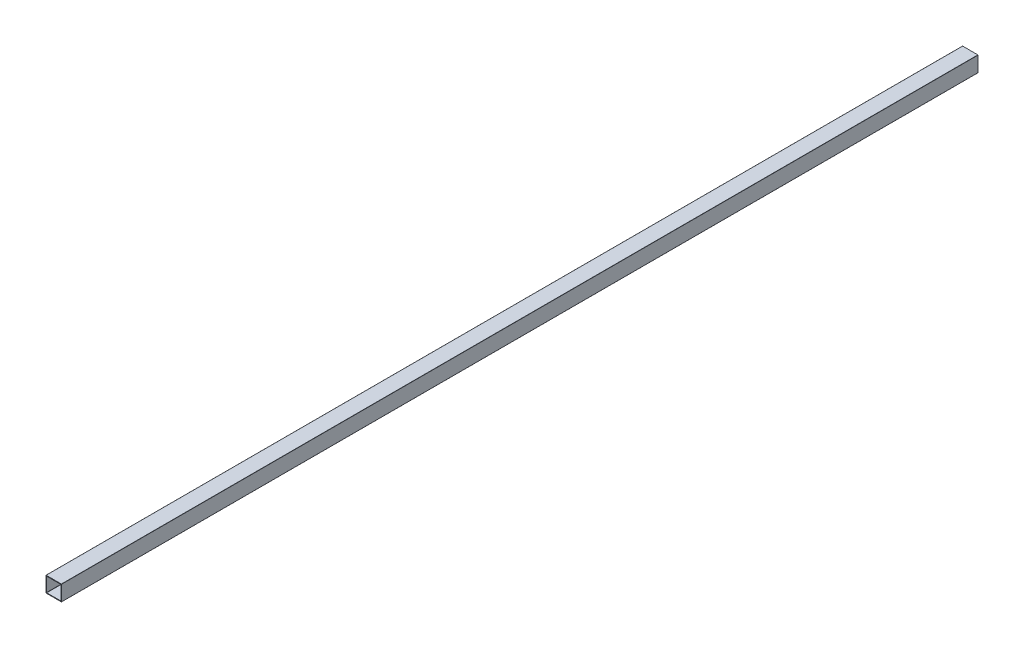
ISO-10303-21;
HEADER;
FILE_DESCRIPTION(('STEP AP214'),'2;1');
FILE_NAME('part.step','',(''),(''),'','','');
FILE_SCHEMA(('AUTOMOTIVE_DESIGN { 1 0 10303 214 1 1 1 1 }'));
ENDSEC;
DATA;
#1=APPLICATION_CONTEXT('core data for automotive mechanical design processes');
#2=APPLICATION_PROTOCOL_DEFINITION('international standard','automotive_design',2000,#1);
#3=PRODUCT_CONTEXT('',#1,'mechanical');
#4=PRODUCT('Part','Part','',(#3));
#5=PRODUCT_RELATED_PRODUCT_CATEGORY('part','',(#4));
#6=PRODUCT_DEFINITION_FORMATION('','',#4);
#7=PRODUCT_DEFINITION_CONTEXT('part definition',#1,'design');
#8=PRODUCT_DEFINITION('design','',#6,#7);
#9=PRODUCT_DEFINITION_SHAPE('','',#8);
#10=(LENGTH_UNIT() NAMED_UNIT(*) SI_UNIT(.MILLI.,.METRE.));
#11=(NAMED_UNIT(*) PLANE_ANGLE_UNIT() SI_UNIT($,.RADIAN.));
#12=(NAMED_UNIT(*) SI_UNIT($,.STERADIAN.) SOLID_ANGLE_UNIT());
#13=UNCERTAINTY_MEASURE_WITH_UNIT(LENGTH_MEASURE(1.E-05),#10,'distance_accuracy_value','');
#14=(GEOMETRIC_REPRESENTATION_CONTEXT(3) GLOBAL_UNCERTAINTY_ASSIGNED_CONTEXT((#13)) GLOBAL_UNIT_ASSIGNED_CONTEXT((#10,
#11,#12)) REPRESENTATION_CONTEXT('',''));
#15=CARTESIAN_POINT('',(0.,0.,0.));
#16=DIRECTION('',(0.,0.,1.));
#17=DIRECTION('',(1.,0.,0.));
#18=AXIS2_PLACEMENT_3D('',#15,#16,#17);
#19=CARTESIAN_POINT('',(50.8,-50.8,-6000.));
#20=DIRECTION('',(1.,0.,0.));
#21=DIRECTION('',(0.,0.,-1.));
#22=AXIS2_PLACEMENT_3D('',#19,#20,#21);
#23=PLANE('',#22);
#24=DIRECTION('',(0.,1.,0.));
#25=VECTOR('',#24,1.);
#26=CARTESIAN_POINT('',(50.8,-50.8,0.));
#27=LINE('',#26,#25);
#28=CARTESIAN_POINT('',(50.8,-49.8,0.));
#29=VERTEX_POINT('',#28);
#30=CARTESIAN_POINT('',(50.8,49.8,0.));
#31=VERTEX_POINT('',#30);
#32=EDGE_CURVE('E197',#29,#31,#27,.T.);
#33=ORIENTED_EDGE('',*,*,#32,.F.);
#34=DIRECTION('',(0.,0.,1.));
#35=VECTOR('',#34,1.);
#36=CARTESIAN_POINT('',(50.8,-49.8,-6000.));
#37=LINE('',#36,#35);
#38=CARTESIAN_POINT('',(50.8,-49.8,-6000.));
#39=VERTEX_POINT('',#38);
#40=EDGE_CURVE('E158',#29,#39,#37,.F.);
#41=ORIENTED_EDGE('',*,*,#40,.T.);
#42=DIRECTION('',(0.,1.,0.));
#43=VECTOR('',#42,1.);
#44=CARTESIAN_POINT('',(50.8,-50.8,-6000.));
#45=LINE('',#44,#43);
#46=CARTESIAN_POINT('',(50.8,49.8,-6000.));
#47=VERTEX_POINT('',#46);
#48=EDGE_CURVE('E185',#39,#47,#45,.T.);
#49=ORIENTED_EDGE('',*,*,#48,.T.);
#50=DIRECTION('',(0.,0.,1.));
#51=VECTOR('',#50,1.);
#52=CARTESIAN_POINT('',(50.8,49.8,-6000.));
#53=LINE('',#52,#51);
#54=EDGE_CURVE('E251',#47,#31,#53,.T.);
#55=ORIENTED_EDGE('',*,*,#54,.T.);
#56=EDGE_LOOP('',(#33,#41,#49,#55));
#57=FACE_BOUND('',#56,.T.);
#58=ADVANCED_FACE('F33',(#57),#23,.T.);
#59=CARTESIAN_POINT('',(-50.8,-50.8,-6000.));
#60=DIRECTION('',(0.,-1.,0.));
#61=DIRECTION('',(0.,0.,-1.));
#62=AXIS2_PLACEMENT_3D('',#59,#60,#61);
#63=PLANE('',#62);
#64=DIRECTION('',(1.,0.,0.));
#65=VECTOR('',#64,1.);
#66=CARTESIAN_POINT('',(-50.8,-50.8,0.));
#67=LINE('',#66,#65);
#68=CARTESIAN_POINT('',(-49.8,-50.8,0.));
#69=VERTEX_POINT('',#68);
#70=CARTESIAN_POINT('',(49.8,-50.8,0.));
#71=VERTEX_POINT('',#70);
#72=EDGE_CURVE('E189',#69,#71,#67,.T.);
#73=ORIENTED_EDGE('',*,*,#72,.F.);
#74=DIRECTION('',(0.,0.,1.));
#75=VECTOR('',#74,1.);
#76=CARTESIAN_POINT('',(-49.8,-50.8,-6000.));
#77=LINE('',#76,#75);
#78=CARTESIAN_POINT('',(-49.8,-50.8,-6000.));
#79=VERTEX_POINT('',#78);
#80=EDGE_CURVE('E238',#69,#79,#77,.F.);
#81=ORIENTED_EDGE('',*,*,#80,.T.);
#82=DIRECTION('',(1.,0.,0.));
#83=VECTOR('',#82,1.);
#84=CARTESIAN_POINT('',(-50.8,-50.8,-6000.));
#85=LINE('',#84,#83);
#86=CARTESIAN_POINT('',(49.8,-50.8,-6000.));
#87=VERTEX_POINT('',#86);
#88=EDGE_CURVE('E194',#79,#87,#85,.T.);
#89=ORIENTED_EDGE('',*,*,#88,.T.);
#90=DIRECTION('',(0.,0.,1.));
#91=VECTOR('',#90,1.);
#92=CARTESIAN_POINT('',(49.8,-50.8,-6000.));
#93=LINE('',#92,#91);
#94=EDGE_CURVE('E235',#87,#71,#93,.T.);
#95=ORIENTED_EDGE('',*,*,#94,.T.);
#96=EDGE_LOOP('',(#73,#81,#89,#95));
#97=FACE_BOUND('',#96,.T.);
#98=ADVANCED_FACE('F305',(#97),#63,.T.);
#99=CARTESIAN_POINT('',(-50.8,-50.8,-6000.));
#100=DIRECTION('',(-1.,0.,0.));
#101=DIRECTION('',(0.,0.,1.));
#102=AXIS2_PLACEMENT_3D('',#99,#100,#101);
#103=PLANE('',#102);
#104=DIRECTION('',(0.,-1.,0.));
#105=VECTOR('',#104,1.);
#106=CARTESIAN_POINT('',(-50.8,-50.8,-6000.));
#107=LINE('',#106,#105);
#108=CARTESIAN_POINT('',(-50.8,49.8,-6000.));
#109=VERTEX_POINT('',#108);
#110=CARTESIAN_POINT('',(-50.8,-49.8,-6000.));
#111=VERTEX_POINT('',#110);
#112=EDGE_CURVE('E191',#109,#111,#107,.T.);
#113=ORIENTED_EDGE('',*,*,#112,.T.);
#114=DIRECTION('',(0.,0.,1.));
#115=VECTOR('',#114,1.);
#116=CARTESIAN_POINT('',(-50.8,-49.8,-6000.));
#117=LINE('',#116,#115);
#118=CARTESIAN_POINT('',(-50.8,-49.8,0.));
#119=VERTEX_POINT('',#118);
#120=EDGE_CURVE('E224',#111,#119,#117,.T.);
#121=ORIENTED_EDGE('',*,*,#120,.T.);
#122=DIRECTION('',(0.,-1.,0.));
#123=VECTOR('',#122,1.);
#124=CARTESIAN_POINT('',(-50.8,-50.8,0.));
#125=LINE('',#124,#123);
#126=CARTESIAN_POINT('',(-50.8,49.8,0.));
#127=VERTEX_POINT('',#126);
#128=EDGE_CURVE('E203',#127,#119,#125,.T.);
#129=ORIENTED_EDGE('',*,*,#128,.F.);
#130=DIRECTION('',(0.,0.,1.));
#131=VECTOR('',#130,1.);
#132=CARTESIAN_POINT('',(-50.8,49.8,-6000.));
#133=LINE('',#132,#131);
#134=EDGE_CURVE('E222',#127,#109,#133,.F.);
#135=ORIENTED_EDGE('',*,*,#134,.T.);
#136=EDGE_LOOP('',(#113,#121,#129,#135));
#137=FACE_BOUND('',#136,.T.);
#138=ADVANCED_FACE('F311',(#137),#103,.T.);
#139=CARTESIAN_POINT('',(-50.8,50.8,-6000.));
#140=DIRECTION('',(0.,1.,0.));
#141=DIRECTION('',(0.,0.,1.));
#142=AXIS2_PLACEMENT_3D('',#139,#140,#141);
#143=PLANE('',#142);
#144=DIRECTION('',(-1.,0.,0.));
#145=VECTOR('',#144,1.);
#146=CARTESIAN_POINT('',(-50.8,50.8,-6000.));
#147=LINE('',#146,#145);
#148=CARTESIAN_POINT('',(49.8,50.8,-6000.));
#149=VERTEX_POINT('',#148);
#150=CARTESIAN_POINT('',(-49.8,50.8,-6000.));
#151=VERTEX_POINT('',#150);
#152=EDGE_CURVE('E188',#149,#151,#147,.T.);
#153=ORIENTED_EDGE('',*,*,#152,.T.);
#154=DIRECTION('',(0.,0.,1.));
#155=VECTOR('',#154,1.);
#156=CARTESIAN_POINT('',(-49.8,50.8,-6000.));
#157=LINE('',#156,#155);
#158=CARTESIAN_POINT('',(-49.8,50.8,0.));
#159=VERTEX_POINT('',#158);
#160=EDGE_CURVE('E248',#151,#159,#157,.T.);
#161=ORIENTED_EDGE('',*,*,#160,.T.);
#162=DIRECTION('',(-1.,0.,0.));
#163=VECTOR('',#162,1.);
#164=CARTESIAN_POINT('',(-50.8,50.8,0.));
#165=LINE('',#164,#163);
#166=CARTESIAN_POINT('',(49.8,50.8,0.));
#167=VERTEX_POINT('',#166);
#168=EDGE_CURVE('E200',#167,#159,#165,.T.);
#169=ORIENTED_EDGE('',*,*,#168,.F.);
#170=DIRECTION('',(0.,0.,1.));
#171=VECTOR('',#170,1.);
#172=CARTESIAN_POINT('',(49.8,50.8,-6000.));
#173=LINE('',#172,#171);
#174=EDGE_CURVE('E55',#167,#149,#173,.F.);
#175=ORIENTED_EDGE('',*,*,#174,.T.);
#176=EDGE_LOOP('',(#153,#161,#169,#175));
#177=FACE_BOUND('',#176,.T.);
#178=ADVANCED_FACE('F316',(#177),#143,.T.);
#179=CARTESIAN_POINT('',(0.,0.,-6000.));
#180=DIRECTION('',(0.,0.,-1.));
#181=DIRECTION('',(-1.,0.,0.));
#182=AXIS2_PLACEMENT_3D('',#179,#180,#181);
#183=PLANE('',#182);
#184=DIRECTION('',(0.,-1.,0.));
#185=VECTOR('',#184,1.);
#186=CARTESIAN_POINT('',(-47.,-47.,-6000.));
#187=LINE('',#186,#185);
#188=CARTESIAN_POINT('',(-47.,46.,-6000.));
#189=VERTEX_POINT('',#188);
#190=CARTESIAN_POINT('',(-47.,-46.,-6000.));
#191=VERTEX_POINT('',#190);
#192=EDGE_CURVE('E167',#189,#191,#187,.T.);
#193=ORIENTED_EDGE('',*,*,#192,.T.);
#194=CARTESIAN_POINT('',(-46.,-46.,-6000.));
#195=DIRECTION('',(0.,0.,-1.));
#196=DIRECTION('',(-1.,0.,0.));
#197=AXIS2_PLACEMENT_3D('',#194,#195,#196);
#198=CIRCLE('',#197,1.);
#199=CARTESIAN_POINT('',(-46.,-47.,-6000.));
#200=VERTEX_POINT('',#199);
#201=EDGE_CURVE('E11',#191,#200,#198,.F.);
#202=ORIENTED_EDGE('',*,*,#201,.T.);
#203=DIRECTION('',(1.,0.,0.));
#204=VECTOR('',#203,1.);
#205=CARTESIAN_POINT('',(-47.,-47.,-6000.));
#206=LINE('',#205,#204);
#207=CARTESIAN_POINT('',(46.,-47.,-6000.));
#208=VERTEX_POINT('',#207);
#209=EDGE_CURVE('E175',#200,#208,#206,.T.);
#210=ORIENTED_EDGE('',*,*,#209,.T.);
#211=CARTESIAN_POINT('',(46.,-46.,-6000.));
#212=DIRECTION('',(0.,0.,-1.));
#213=DIRECTION('',(-1.,0.,0.));
#214=AXIS2_PLACEMENT_3D('',#211,#212,#213);
#215=CIRCLE('',#214,1.);
#216=CARTESIAN_POINT('',(47.,-46.,-6000.));
#217=VERTEX_POINT('',#216);
#218=EDGE_CURVE('E262',#208,#217,#215,.F.);
#219=ORIENTED_EDGE('',*,*,#218,.T.);
#220=DIRECTION('',(0.,1.,0.));
#221=VECTOR('',#220,1.);
#222=CARTESIAN_POINT('',(47.,-47.,-6000.));
#223=LINE('',#222,#221);
#224=CARTESIAN_POINT('',(47.,46.,-6000.));
#225=VERTEX_POINT('',#224);
#226=EDGE_CURVE('E179',#217,#225,#223,.T.);
#227=ORIENTED_EDGE('',*,*,#226,.T.);
#228=CARTESIAN_POINT('',(46.,46.,-6000.));
#229=DIRECTION('',(0.,0.,-1.));
#230=DIRECTION('',(-1.,0.,0.));
#231=AXIS2_PLACEMENT_3D('',#228,#229,#230);
#232=CIRCLE('',#231,1.);
#233=CARTESIAN_POINT('',(46.,47.,-6000.));
#234=VERTEX_POINT('',#233);
#235=EDGE_CURVE('E258',#225,#234,#232,.F.);
#236=ORIENTED_EDGE('',*,*,#235,.T.);
#237=DIRECTION('',(-1.,0.,0.));
#238=VECTOR('',#237,1.);
#239=CARTESIAN_POINT('',(-47.,47.,-6000.));
#240=LINE('',#239,#238);
#241=CARTESIAN_POINT('',(-46.,47.,-6000.));
#242=VERTEX_POINT('',#241);
#243=EDGE_CURVE('E277',#234,#242,#240,.T.);
#244=ORIENTED_EDGE('',*,*,#243,.T.);
#245=CARTESIAN_POINT('',(-46.,46.,-6000.));
#246=DIRECTION('',(0.,0.,-1.));
#247=DIRECTION('',(-1.,0.,0.));
#248=AXIS2_PLACEMENT_3D('',#245,#246,#247);
#249=CIRCLE('',#248,1.);
#250=EDGE_CURVE('E157',#242,#189,#249,.F.);
#251=ORIENTED_EDGE('',*,*,#250,.T.);
#252=EDGE_LOOP('',(#193,#202,#210,#219,#227,#236,#244,#251));
#253=FACE_BOUND('',#252,.T.);
#254=ORIENTED_EDGE('',*,*,#88,.F.);
#255=CARTESIAN_POINT('',(-49.8,-49.8,-6000.));
#256=DIRECTION('',(0.,0.,-1.));
#257=DIRECTION('',(-1.,0.,0.));
#258=AXIS2_PLACEMENT_3D('',#255,#256,#257);
#259=CIRCLE('',#258,1.);
#260=EDGE_CURVE('E245',#79,#111,#259,.T.);
#261=ORIENTED_EDGE('',*,*,#260,.T.);
#262=ORIENTED_EDGE('',*,*,#112,.F.);
#263=CARTESIAN_POINT('',(-49.8,49.8,-6000.));
#264=DIRECTION('',(0.,0.,-1.));
#265=DIRECTION('',(-1.,0.,0.));
#266=AXIS2_PLACEMENT_3D('',#263,#264,#265);
#267=CIRCLE('',#266,1.);
#268=EDGE_CURVE('E48',#109,#151,#267,.T.);
#269=ORIENTED_EDGE('',*,*,#268,.T.);
#270=ORIENTED_EDGE('',*,*,#152,.F.);
#271=CARTESIAN_POINT('',(49.8,49.8,-6000.));
#272=DIRECTION('',(0.,0.,-1.));
#273=DIRECTION('',(-1.,0.,0.));
#274=AXIS2_PLACEMENT_3D('',#271,#272,#273);
#275=CIRCLE('',#274,1.);
#276=EDGE_CURVE('E240',#149,#47,#275,.T.);
#277=ORIENTED_EDGE('',*,*,#276,.T.);
#278=ORIENTED_EDGE('',*,*,#48,.F.);
#279=CARTESIAN_POINT('',(49.8,-49.8,-6000.));
#280=DIRECTION('',(0.,0.,-1.));
#281=DIRECTION('',(-1.,0.,0.));
#282=AXIS2_PLACEMENT_3D('',#279,#280,#281);
#283=CIRCLE('',#282,1.);
#284=EDGE_CURVE('E242',#39,#87,#283,.T.);
#285=ORIENTED_EDGE('',*,*,#284,.T.);
#286=EDGE_LOOP('',(#254,#261,#262,#269,#270,#277,#278,#285));
#287=FACE_BOUND('',#286,.T.);
#288=ADVANCED_FACE('F267',(#253,#287),#183,.T.);
#289=CARTESIAN_POINT('',(0.,0.,0.));
#290=DIRECTION('',(0.,0.,-1.));
#291=DIRECTION('',(-1.,0.,0.));
#292=AXIS2_PLACEMENT_3D('',#289,#290,#291);
#293=PLANE('',#292);
#294=DIRECTION('',(0.,1.,0.));
#295=VECTOR('',#294,1.);
#296=CARTESIAN_POINT('',(47.,-47.,0.));
#297=LINE('',#296,#295);
#298=CARTESIAN_POINT('',(47.,-46.,0.));
#299=VERTEX_POINT('',#298);
#300=CARTESIAN_POINT('',(47.,46.,0.));
#301=VERTEX_POINT('',#300);
#302=EDGE_CURVE('E181',#299,#301,#297,.T.);
#303=ORIENTED_EDGE('',*,*,#302,.F.);
#304=CARTESIAN_POINT('',(46.,-46.,0.));
#305=DIRECTION('',(0.,0.,-1.));
#306=DIRECTION('',(-1.,0.,0.));
#307=AXIS2_PLACEMENT_3D('',#304,#305,#306);
#308=CIRCLE('',#307,1.);
#309=CARTESIAN_POINT('',(46.,-47.,0.));
#310=VERTEX_POINT('',#309);
#311=EDGE_CURVE('E260',#299,#310,#308,.T.);
#312=ORIENTED_EDGE('',*,*,#311,.T.);
#313=DIRECTION('',(1.,0.,0.));
#314=VECTOR('',#313,1.);
#315=CARTESIAN_POINT('',(-47.,-47.,0.));
#316=LINE('',#315,#314);
#317=CARTESIAN_POINT('',(-46.,-47.,0.));
#318=VERTEX_POINT('',#317);
#319=EDGE_CURVE('E281',#318,#310,#316,.T.);
#320=ORIENTED_EDGE('',*,*,#319,.F.);
#321=CARTESIAN_POINT('',(-46.,-46.,0.));
#322=DIRECTION('',(0.,0.,-1.));
#323=DIRECTION('',(-1.,0.,0.));
#324=AXIS2_PLACEMENT_3D('',#321,#322,#323);
#325=CIRCLE('',#324,1.);
#326=CARTESIAN_POINT('',(-47.,-46.,0.));
#327=VERTEX_POINT('',#326);
#328=EDGE_CURVE('E41',#318,#327,#325,.T.);
#329=ORIENTED_EDGE('',*,*,#328,.T.);
#330=DIRECTION('',(0.,-1.,0.));
#331=VECTOR('',#330,1.);
#332=CARTESIAN_POINT('',(-47.,-47.,0.));
#333=LINE('',#332,#331);
#334=CARTESIAN_POINT('',(-47.,46.,0.));
#335=VERTEX_POINT('',#334);
#336=EDGE_CURVE('E164',#335,#327,#333,.T.);
#337=ORIENTED_EDGE('',*,*,#336,.F.);
#338=CARTESIAN_POINT('',(-46.,46.,0.));
#339=DIRECTION('',(0.,0.,-1.));
#340=DIRECTION('',(-1.,0.,0.));
#341=AXIS2_PLACEMENT_3D('',#338,#339,#340);
#342=CIRCLE('',#341,1.);
#343=CARTESIAN_POINT('',(-46.,47.,0.));
#344=VERTEX_POINT('',#343);
#345=EDGE_CURVE('E147',#335,#344,#342,.T.);
#346=ORIENTED_EDGE('',*,*,#345,.T.);
#347=DIRECTION('',(-1.,0.,0.));
#348=VECTOR('',#347,1.);
#349=CARTESIAN_POINT('',(-47.,47.,0.));
#350=LINE('',#349,#348);
#351=CARTESIAN_POINT('',(46.,47.,0.));
#352=VERTEX_POINT('',#351);
#353=EDGE_CURVE('E176',#352,#344,#350,.T.);
#354=ORIENTED_EDGE('',*,*,#353,.F.);
#355=CARTESIAN_POINT('',(46.,46.,0.));
#356=DIRECTION('',(0.,0.,-1.));
#357=DIRECTION('',(-1.,0.,0.));
#358=AXIS2_PLACEMENT_3D('',#355,#356,#357);
#359=CIRCLE('',#358,1.);
#360=EDGE_CURVE('E256',#352,#301,#359,.T.);
#361=ORIENTED_EDGE('',*,*,#360,.T.);
#362=EDGE_LOOP('',(#303,#312,#320,#329,#337,#346,#354,#361));
#363=FACE_BOUND('',#362,.T.);
#364=ORIENTED_EDGE('',*,*,#128,.T.);
#365=CARTESIAN_POINT('',(-49.8,-49.8,0.));
#366=DIRECTION('',(0.,0.,-1.));
#367=DIRECTION('',(-1.,0.,0.));
#368=AXIS2_PLACEMENT_3D('',#365,#366,#367);
#369=CIRCLE('',#368,1.);
#370=EDGE_CURVE('E233',#119,#69,#369,.F.);
#371=ORIENTED_EDGE('',*,*,#370,.T.);
#372=ORIENTED_EDGE('',*,*,#72,.T.);
#373=CARTESIAN_POINT('',(49.8,-49.8,0.));
#374=DIRECTION('',(0.,0.,-1.));
#375=DIRECTION('',(-1.,0.,0.));
#376=AXIS2_PLACEMENT_3D('',#373,#374,#375);
#377=CIRCLE('',#376,1.);
#378=EDGE_CURVE('E229',#71,#29,#377,.F.);
#379=ORIENTED_EDGE('',*,*,#378,.T.);
#380=ORIENTED_EDGE('',*,*,#32,.T.);
#381=CARTESIAN_POINT('',(49.8,49.8,0.));
#382=DIRECTION('',(0.,0.,-1.));
#383=DIRECTION('',(-1.,0.,0.));
#384=AXIS2_PLACEMENT_3D('',#381,#382,#383);
#385=CIRCLE('',#384,1.);
#386=EDGE_CURVE('E227',#31,#167,#385,.F.);
#387=ORIENTED_EDGE('',*,*,#386,.T.);
#388=ORIENTED_EDGE('',*,*,#168,.T.);
#389=CARTESIAN_POINT('',(-49.8,49.8,0.));
#390=DIRECTION('',(0.,0.,-1.));
#391=DIRECTION('',(-1.,0.,0.));
#392=AXIS2_PLACEMENT_3D('',#389,#390,#391);
#393=CIRCLE('',#392,1.);
#394=EDGE_CURVE('E231',#159,#127,#393,.F.);
#395=ORIENTED_EDGE('',*,*,#394,.T.);
#396=EDGE_LOOP('',(#364,#371,#372,#379,#380,#387,#388,#395));
#397=FACE_BOUND('',#396,.T.);
#398=ADVANCED_FACE('F172',(#363,#397),#293,.F.);
#399=CARTESIAN_POINT('',(-47.,-47.,-6000.));
#400=DIRECTION('',(0.,-1.,0.));
#401=DIRECTION('',(0.,0.,-1.));
#402=AXIS2_PLACEMENT_3D('',#399,#400,#401);
#403=PLANE('',#402);
#404=ORIENTED_EDGE('',*,*,#319,.T.);
#405=DIRECTION('',(0.,0.,1.));
#406=VECTOR('',#405,1.);
#407=CARTESIAN_POINT('',(46.,-47.,-6000.));
#408=LINE('',#407,#406);
#409=EDGE_CURVE('E220',#310,#208,#408,.F.);
#410=ORIENTED_EDGE('',*,*,#409,.T.);
#411=ORIENTED_EDGE('',*,*,#209,.F.);
#412=DIRECTION('',(0.,0.,1.));
#413=VECTOR('',#412,1.);
#414=CARTESIAN_POINT('',(-46.,-47.,0.));
#415=LINE('',#414,#413);
#416=EDGE_CURVE('E217',#200,#318,#415,.T.);
#417=ORIENTED_EDGE('',*,*,#416,.T.);
#418=EDGE_LOOP('',(#404,#410,#411,#417));
#419=FACE_BOUND('',#418,.T.);
#420=ADVANCED_FACE('F283',(#419),#403,.F.);
#421=CARTESIAN_POINT('',(-47.,-47.,-6000.));
#422=DIRECTION('',(-1.,0.,0.));
#423=DIRECTION('',(0.,0.,1.));
#424=AXIS2_PLACEMENT_3D('',#421,#422,#423);
#425=PLANE('',#424);
#426=ORIENTED_EDGE('',*,*,#192,.F.);
#427=DIRECTION('',(0.,0.,1.));
#428=VECTOR('',#427,1.);
#429=CARTESIAN_POINT('',(-47.,46.,0.));
#430=LINE('',#429,#428);
#431=EDGE_CURVE('E151',#189,#335,#430,.T.);
#432=ORIENTED_EDGE('',*,*,#431,.T.);
#433=ORIENTED_EDGE('',*,*,#336,.T.);
#434=DIRECTION('',(0.,0.,1.));
#435=VECTOR('',#434,1.);
#436=CARTESIAN_POINT('',(-47.,-46.,-6000.));
#437=LINE('',#436,#435);
#438=EDGE_CURVE('E169',#327,#191,#437,.F.);
#439=ORIENTED_EDGE('',*,*,#438,.T.);
#440=EDGE_LOOP('',(#426,#432,#433,#439));
#441=FACE_BOUND('',#440,.T.);
#442=ADVANCED_FACE('F163',(#441),#425,.F.);
#443=CARTESIAN_POINT('',(-47.,47.,-6000.));
#444=DIRECTION('',(0.,1.,0.));
#445=DIRECTION('',(0.,0.,1.));
#446=AXIS2_PLACEMENT_3D('',#443,#444,#445);
#447=PLANE('',#446);
#448=ORIENTED_EDGE('',*,*,#353,.T.);
#449=DIRECTION('',(0.,0.,1.));
#450=VECTOR('',#449,1.);
#451=CARTESIAN_POINT('',(-46.,47.,-6000.));
#452=LINE('',#451,#450);
#453=EDGE_CURVE('E152',#344,#242,#452,.F.);
#454=ORIENTED_EDGE('',*,*,#453,.T.);
#455=ORIENTED_EDGE('',*,*,#243,.F.);
#456=DIRECTION('',(0.,0.,1.));
#457=VECTOR('',#456,1.);
#458=CARTESIAN_POINT('',(46.,47.,0.));
#459=LINE('',#458,#457);
#460=EDGE_CURVE('E168',#234,#352,#459,.T.);
#461=ORIENTED_EDGE('',*,*,#460,.T.);
#462=EDGE_LOOP('',(#448,#454,#455,#461));
#463=FACE_BOUND('',#462,.T.);
#464=ADVANCED_FACE('F292',(#463),#447,.F.);
#465=CARTESIAN_POINT('',(47.,-47.,-6000.));
#466=DIRECTION('',(1.,0.,0.));
#467=DIRECTION('',(0.,0.,-1.));
#468=AXIS2_PLACEMENT_3D('',#465,#466,#467);
#469=PLANE('',#468);
#470=ORIENTED_EDGE('',*,*,#302,.T.);
#471=DIRECTION('',(0.,0.,1.));
#472=VECTOR('',#471,1.);
#473=CARTESIAN_POINT('',(47.,46.,-6000.));
#474=LINE('',#473,#472);
#475=EDGE_CURVE('E215',#301,#225,#474,.F.);
#476=ORIENTED_EDGE('',*,*,#475,.T.);
#477=ORIENTED_EDGE('',*,*,#226,.F.);
#478=DIRECTION('',(0.,0.,1.));
#479=VECTOR('',#478,1.);
#480=CARTESIAN_POINT('',(47.,-46.,0.));
#481=LINE('',#480,#479);
#482=EDGE_CURVE('E212',#217,#299,#481,.T.);
#483=ORIENTED_EDGE('',*,*,#482,.T.);
#484=EDGE_LOOP('',(#470,#476,#477,#483));
#485=FACE_BOUND('',#484,.T.);
#486=ADVANCED_FACE('F275',(#485),#469,.F.);
#487=CARTESIAN_POINT('',(-46.,46.,-6000.));
#488=DIRECTION('',(0.,0.,-1.));
#489=DIRECTION('',(-1.,0.,0.));
#490=AXIS2_PLACEMENT_3D('',#487,#488,#489);
#491=CYLINDRICAL_SURFACE('',#490,1.);
#492=ORIENTED_EDGE('',*,*,#250,.F.);
#493=ORIENTED_EDGE('',*,*,#453,.F.);
#494=ORIENTED_EDGE('',*,*,#345,.F.);
#495=ORIENTED_EDGE('',*,*,#431,.F.);
#496=EDGE_LOOP('',(#492,#493,#494,#495));
#497=FACE_BOUND('',#496,.T.);
#498=ADVANCED_FACE('F150',(#497),#491,.F.);
#499=CARTESIAN_POINT('',(46.,46.,-6000.));
#500=DIRECTION('',(0.,0.,-1.));
#501=DIRECTION('',(-1.,0.,0.));
#502=AXIS2_PLACEMENT_3D('',#499,#500,#501);
#503=CYLINDRICAL_SURFACE('',#502,1.);
#504=ORIENTED_EDGE('',*,*,#235,.F.);
#505=ORIENTED_EDGE('',*,*,#475,.F.);
#506=ORIENTED_EDGE('',*,*,#360,.F.);
#507=ORIENTED_EDGE('',*,*,#460,.F.);
#508=EDGE_LOOP('',(#504,#505,#506,#507));
#509=FACE_BOUND('',#508,.T.);
#510=ADVANCED_FACE('F294',(#509),#503,.F.);
#511=CARTESIAN_POINT('',(46.,-46.,-6000.));
#512=DIRECTION('',(0.,0.,-1.));
#513=DIRECTION('',(-1.,0.,0.));
#514=AXIS2_PLACEMENT_3D('',#511,#512,#513);
#515=CYLINDRICAL_SURFACE('',#514,1.);
#516=ORIENTED_EDGE('',*,*,#218,.F.);
#517=ORIENTED_EDGE('',*,*,#409,.F.);
#518=ORIENTED_EDGE('',*,*,#311,.F.);
#519=ORIENTED_EDGE('',*,*,#482,.F.);
#520=EDGE_LOOP('',(#516,#517,#518,#519));
#521=FACE_BOUND('',#520,.T.);
#522=ADVANCED_FACE('F279',(#521),#515,.F.);
#523=CARTESIAN_POINT('',(-49.8,-49.8,-6000.));
#524=DIRECTION('',(0.,0.,1.));
#525=DIRECTION('',(1.,0.,0.));
#526=AXIS2_PLACEMENT_3D('',#523,#524,#525);
#527=CYLINDRICAL_SURFACE('',#526,1.);
#528=ORIENTED_EDGE('',*,*,#260,.F.);
#529=ORIENTED_EDGE('',*,*,#80,.F.);
#530=ORIENTED_EDGE('',*,*,#370,.F.);
#531=ORIENTED_EDGE('',*,*,#120,.F.);
#532=EDGE_LOOP('',(#528,#529,#530,#531));
#533=FACE_BOUND('',#532,.T.);
#534=ADVANCED_FACE('F301',(#533),#527,.T.);
#535=CARTESIAN_POINT('',(-49.8,49.8,-6000.));
#536=DIRECTION('',(0.,0.,1.));
#537=DIRECTION('',(1.,0.,0.));
#538=AXIS2_PLACEMENT_3D('',#535,#536,#537);
#539=CYLINDRICAL_SURFACE('',#538,1.);
#540=ORIENTED_EDGE('',*,*,#268,.F.);
#541=ORIENTED_EDGE('',*,*,#134,.F.);
#542=ORIENTED_EDGE('',*,*,#394,.F.);
#543=ORIENTED_EDGE('',*,*,#160,.F.);
#544=EDGE_LOOP('',(#540,#541,#542,#543));
#545=FACE_BOUND('',#544,.T.);
#546=ADVANCED_FACE('F368',(#545),#539,.T.);
#547=CARTESIAN_POINT('',(-46.,-46.,-6000.));
#548=DIRECTION('',(0.,0.,-1.));
#549=DIRECTION('',(-1.,0.,0.));
#550=AXIS2_PLACEMENT_3D('',#547,#548,#549);
#551=CYLINDRICAL_SURFACE('',#550,1.);
#552=ORIENTED_EDGE('',*,*,#201,.F.);
#553=ORIENTED_EDGE('',*,*,#438,.F.);
#554=ORIENTED_EDGE('',*,*,#328,.F.);
#555=ORIENTED_EDGE('',*,*,#416,.F.);
#556=EDGE_LOOP('',(#552,#553,#554,#555));
#557=FACE_BOUND('',#556,.T.);
#558=ADVANCED_FACE('F378',(#557),#551,.F.);
#559=CARTESIAN_POINT('',(49.8,-49.8,-6000.));
#560=DIRECTION('',(0.,0.,1.));
#561=DIRECTION('',(1.,0.,0.));
#562=AXIS2_PLACEMENT_3D('',#559,#560,#561);
#563=CYLINDRICAL_SURFACE('',#562,1.);
#564=ORIENTED_EDGE('',*,*,#284,.F.);
#565=ORIENTED_EDGE('',*,*,#40,.F.);
#566=ORIENTED_EDGE('',*,*,#378,.F.);
#567=ORIENTED_EDGE('',*,*,#94,.F.);
#568=EDGE_LOOP('',(#564,#565,#566,#567));
#569=FACE_BOUND('',#568,.T.);
#570=ADVANCED_FACE('F388',(#569),#563,.T.);
#571=CARTESIAN_POINT('',(49.8,49.8,-6000.));
#572=DIRECTION('',(0.,0.,1.));
#573=DIRECTION('',(1.,0.,0.));
#574=AXIS2_PLACEMENT_3D('',#571,#572,#573);
#575=CYLINDRICAL_SURFACE('',#574,1.);
#576=ORIENTED_EDGE('',*,*,#276,.F.);
#577=ORIENTED_EDGE('',*,*,#174,.F.);
#578=ORIENTED_EDGE('',*,*,#386,.F.);
#579=ORIENTED_EDGE('',*,*,#54,.F.);
#580=EDGE_LOOP('',(#576,#577,#578,#579));
#581=FACE_BOUND('',#580,.T.);
#582=ADVANCED_FACE('F35',(#581),#575,.T.);
#583=CLOSED_SHELL('',(#58,#98,#138,#178,#288,#398,#420,#442,#464,#486,#498,#510,#522,#534,#546,
#558,#570,#582));
#584=MANIFOLD_SOLID_BREP('B2',#583);
#585=ADVANCED_BREP_SHAPE_REPRESENTATION('',(#18,#584),#14);
#586=SHAPE_DEFINITION_REPRESENTATION(#9,#585);
ENDSEC;
END-ISO-10303-21;
